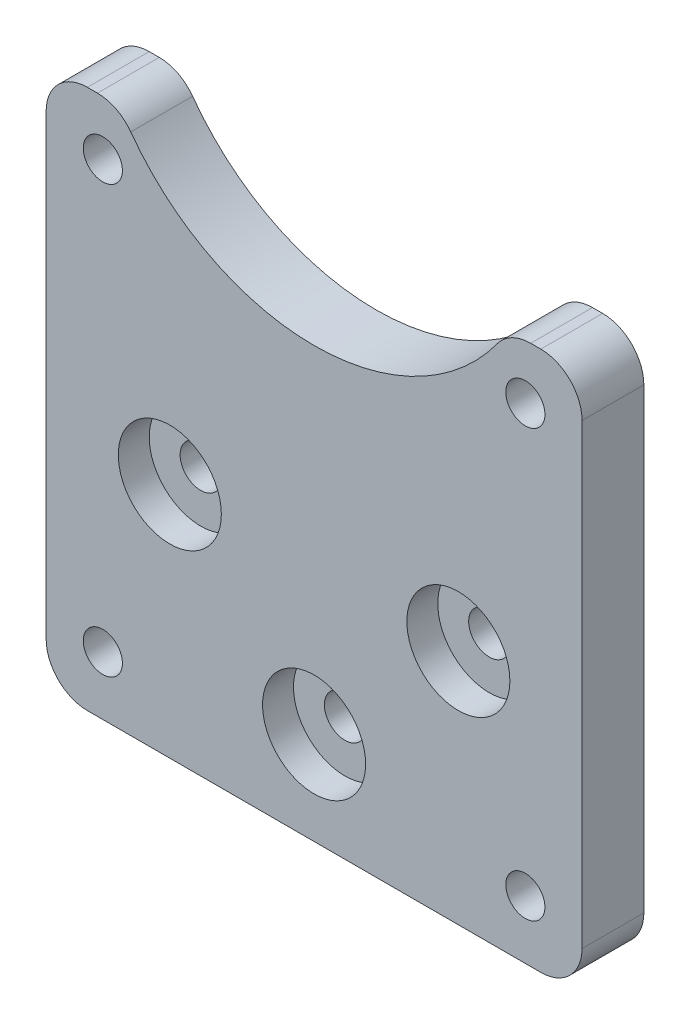
ISO-10303-21;
HEADER;
FILE_DESCRIPTION(('STEP AP214'),'2;1');
FILE_NAME('part.step','',(''),(''),'','','');
FILE_SCHEMA(('AUTOMOTIVE_DESIGN { 1 0 10303 214 1 1 1 1 }'));
ENDSEC;
DATA;
#1=APPLICATION_CONTEXT('core data for automotive mechanical design processes');
#2=APPLICATION_PROTOCOL_DEFINITION('international standard','automotive_design',2000,#1);
#3=PRODUCT_CONTEXT('',#1,'mechanical');
#4=PRODUCT('Part','Part','',(#3));
#5=PRODUCT_RELATED_PRODUCT_CATEGORY('part','',(#4));
#6=PRODUCT_DEFINITION_FORMATION('','',#4);
#7=PRODUCT_DEFINITION_CONTEXT('part definition',#1,'design');
#8=PRODUCT_DEFINITION('design','',#6,#7);
#9=PRODUCT_DEFINITION_SHAPE('','',#8);
#10=(LENGTH_UNIT() NAMED_UNIT(*) SI_UNIT(.MILLI.,.METRE.));
#11=(NAMED_UNIT(*) PLANE_ANGLE_UNIT() SI_UNIT($,.RADIAN.));
#12=(NAMED_UNIT(*) SI_UNIT($,.STERADIAN.) SOLID_ANGLE_UNIT());
#13=UNCERTAINTY_MEASURE_WITH_UNIT(LENGTH_MEASURE(1.E-05),#10,'distance_accuracy_value','');
#14=(GEOMETRIC_REPRESENTATION_CONTEXT(3) GLOBAL_UNCERTAINTY_ASSIGNED_CONTEXT((#13)) GLOBAL_UNIT_ASSIGNED_CONTEXT((#10,
#11,#12)) REPRESENTATION_CONTEXT('',''));
#15=CARTESIAN_POINT('',(0.,0.,0.));
#16=DIRECTION('',(0.,0.,1.));
#17=DIRECTION('',(1.,0.,0.));
#18=AXIS2_PLACEMENT_3D('',#15,#16,#17);
#19=CARTESIAN_POINT('',(7.00000000000001,3.5,3.));
#20=DIRECTION('',(0.,0.,-1.));
#21=DIRECTION('',(-1.,0.,0.));
#22=AXIS2_PLACEMENT_3D('',#19,#20,#21);
#23=CYLINDRICAL_SURFACE('',#22,1.);
#24=CARTESIAN_POINT('',(7.00000000000001,3.5,0.));
#25=DIRECTION('',(0.,0.,1.));
#26=DIRECTION('',(1.,0.,0.));
#27=AXIS2_PLACEMENT_3D('',#24,#25,#26);
#28=CIRCLE('',#27,1.);
#29=CARTESIAN_POINT('',(8.00000000000001,3.5,0.));
#30=VERTEX_POINT('',#29);
#31=EDGE_CURVE('E228',#30,#30,#28,.T.);
#32=ORIENTED_EDGE('',*,*,#31,.F.);
#33=EDGE_LOOP('',(#32));
#34=FACE_BOUND('',#33,.T.);
#35=CARTESIAN_POINT('',(7.00000000000001,3.5,1.5));
#36=DIRECTION('',(0.,0.,1.));
#37=DIRECTION('',(1.,0.,0.));
#38=AXIS2_PLACEMENT_3D('',#35,#36,#37);
#39=CIRCLE('',#38,1.);
#40=CARTESIAN_POINT('',(8.00000000000001,3.5,1.5));
#41=VERTEX_POINT('',#40);
#42=EDGE_CURVE('E169',#41,#41,#39,.T.);
#43=ORIENTED_EDGE('',*,*,#42,.T.);
#44=EDGE_LOOP('',(#43));
#45=FACE_BOUND('',#44,.T.);
#46=ADVANCED_FACE('F35',(#34,#45),#23,.F.);
#47=CARTESIAN_POINT('',(-6.99999999999999,3.5,3.));
#48=DIRECTION('',(0.,0.,-1.));
#49=DIRECTION('',(-1.,0.,0.));
#50=AXIS2_PLACEMENT_3D('',#47,#48,#49);
#51=CYLINDRICAL_SURFACE('',#50,1.);
#52=CARTESIAN_POINT('',(-6.99999999999999,3.5,0.));
#53=DIRECTION('',(0.,0.,1.));
#54=DIRECTION('',(-1.,0.,0.));
#55=AXIS2_PLACEMENT_3D('',#52,#53,#54);
#56=CIRCLE('',#55,1.);
#57=CARTESIAN_POINT('',(-8.,3.5,0.));
#58=VERTEX_POINT('',#57);
#59=EDGE_CURVE('E254',#58,#58,#56,.T.);
#60=ORIENTED_EDGE('',*,*,#59,.F.);
#61=EDGE_LOOP('',(#60));
#62=FACE_BOUND('',#61,.T.);
#63=CARTESIAN_POINT('',(-6.99999999999999,3.5,1.5));
#64=DIRECTION('',(0.,0.,1.));
#65=DIRECTION('',(1.,0.,0.));
#66=AXIS2_PLACEMENT_3D('',#63,#64,#65);
#67=CIRCLE('',#66,1.);
#68=CARTESIAN_POINT('',(-5.99999999999999,3.5,1.5));
#69=VERTEX_POINT('',#68);
#70=EDGE_CURVE('E165',#69,#69,#67,.T.);
#71=ORIENTED_EDGE('',*,*,#70,.T.);
#72=EDGE_LOOP('',(#71));
#73=FACE_BOUND('',#72,.T.);
#74=ADVANCED_FACE('F354',(#62,#73),#51,.F.);
#75=CARTESIAN_POINT('',(0.,-3.5,3.));
#76=DIRECTION('',(0.,0.,-1.));
#77=DIRECTION('',(-1.,0.,0.));
#78=AXIS2_PLACEMENT_3D('',#75,#76,#77);
#79=CYLINDRICAL_SURFACE('',#78,1.);
#80=CARTESIAN_POINT('',(0.,-3.5,0.));
#81=DIRECTION('',(0.,0.,1.));
#82=DIRECTION('',(1.,0.,0.));
#83=AXIS2_PLACEMENT_3D('',#80,#81,#82);
#84=CIRCLE('',#83,1.);
#85=CARTESIAN_POINT('',(1.00000000000001,-3.5,0.));
#86=VERTEX_POINT('',#85);
#87=EDGE_CURVE('E257',#86,#86,#84,.T.);
#88=ORIENTED_EDGE('',*,*,#87,.F.);
#89=EDGE_LOOP('',(#88));
#90=FACE_BOUND('',#89,.T.);
#91=CARTESIAN_POINT('',(0.,-3.5,1.5));
#92=DIRECTION('',(0.,0.,1.));
#93=DIRECTION('',(1.,0.,0.));
#94=AXIS2_PLACEMENT_3D('',#91,#92,#93);
#95=CIRCLE('',#94,1.);
#96=CARTESIAN_POINT('',(1.00000000000001,-3.5,1.5));
#97=VERTEX_POINT('',#96);
#98=EDGE_CURVE('E162',#97,#97,#95,.T.);
#99=ORIENTED_EDGE('',*,*,#98,.T.);
#100=EDGE_LOOP('',(#99));
#101=FACE_BOUND('',#100,.T.);
#102=ADVANCED_FACE('F312',(#90,#101),#79,.F.);
#103=CARTESIAN_POINT('',(0.,23.8400121122048,3.));
#104=DIRECTION('',(0.,0.,1.));
#105=DIRECTION('',(1.,0.,0.));
#106=AXIS2_PLACEMENT_3D('',#103,#104,#105);
#107=PLANE('',#106);
#108=CARTESIAN_POINT('',(-6.99999999999999,3.5,3.));
#109=DIRECTION('',(0.,0.,1.));
#110=DIRECTION('',(1.,0.,0.));
#111=AXIS2_PLACEMENT_3D('',#108,#109,#110);
#112=CIRCLE('',#111,2.5);
#113=CARTESIAN_POINT('',(-4.5,3.5,3.));
#114=VERTEX_POINT('',#113);
#115=EDGE_CURVE('E295',#114,#114,#112,.T.);
#116=ORIENTED_EDGE('',*,*,#115,.F.);
#117=EDGE_LOOP('',(#116));
#118=FACE_BOUND('',#117,.T.);
#119=CARTESIAN_POINT('',(7.00000000000001,3.5,3.));
#120=DIRECTION('',(0.,0.,1.));
#121=DIRECTION('',(1.,0.,0.));
#122=AXIS2_PLACEMENT_3D('',#119,#120,#121);
#123=CIRCLE('',#122,2.5);
#124=CARTESIAN_POINT('',(9.50000000000001,3.5,3.));
#125=VERTEX_POINT('',#124);
#126=EDGE_CURVE('E289',#125,#125,#123,.T.);
#127=ORIENTED_EDGE('',*,*,#126,.F.);
#128=EDGE_LOOP('',(#127));
#129=FACE_BOUND('',#128,.T.);
#130=CARTESIAN_POINT('',(0.,-3.5,3.));
#131=DIRECTION('',(0.,0.,1.));
#132=DIRECTION('',(1.,0.,0.));
#133=AXIS2_PLACEMENT_3D('',#130,#131,#132);
#134=CIRCLE('',#133,2.5);
#135=CARTESIAN_POINT('',(2.50000000000001,-3.5,3.));
#136=VERTEX_POINT('',#135);
#137=EDGE_CURVE('E283',#136,#136,#134,.T.);
#138=ORIENTED_EDGE('',*,*,#137,.F.);
#139=EDGE_LOOP('',(#138));
#140=FACE_BOUND('',#139,.T.);
#141=CARTESIAN_POINT('',(-10.2499999999998,-5.15998788779531,3.));
#142=DIRECTION('',(0.,0.,1.));
#143=DIRECTION('',(1.,0.,0.));
#144=AXIS2_PLACEMENT_3D('',#141,#142,#143);
#145=CIRCLE('',#144,0.949999999999999);
#146=CARTESIAN_POINT('',(-9.29999999999979,-5.15998788779531,3.));
#147=VERTEX_POINT('',#146);
#148=EDGE_CURVE('E270',#147,#147,#145,.T.);
#149=ORIENTED_EDGE('',*,*,#148,.F.);
#150=EDGE_LOOP('',(#149));
#151=FACE_BOUND('',#150,.T.);
#152=CARTESIAN_POINT('',(10.2500000000001,15.5400121122048,3.));
#153=DIRECTION('',(0.,0.,1.));
#154=DIRECTION('',(1.,0.,0.));
#155=AXIS2_PLACEMENT_3D('',#152,#153,#154);
#156=CIRCLE('',#155,0.949999999999999);
#157=CARTESIAN_POINT('',(11.2000000000001,15.5400121122048,3.));
#158=VERTEX_POINT('',#157);
#159=EDGE_CURVE('E260',#158,#158,#156,.T.);
#160=ORIENTED_EDGE('',*,*,#159,.F.);
#161=EDGE_LOOP('',(#160));
#162=FACE_BOUND('',#161,.T.);
#163=DIRECTION('',(0.,-1.,0.));
#164=VECTOR('',#163,1.);
#165=CARTESIAN_POINT('',(-13.,18.1900121122046,3.));
#166=LINE('',#165,#164);
#167=CARTESIAN_POINT('',(-13.,16.1900121122046,3.));
#168=VERTEX_POINT('',#167);
#169=CARTESIAN_POINT('',(-13.,-5.99999999999999,3.));
#170=VERTEX_POINT('',#169);
#171=EDGE_CURVE('E242',#168,#170,#166,.T.);
#172=ORIENTED_EDGE('',*,*,#171,.T.);
#173=CARTESIAN_POINT('',(-11.,-6.,3.));
#174=DIRECTION('',(0.,0.,1.));
#175=DIRECTION('',(1.,0.,0.));
#176=AXIS2_PLACEMENT_3D('',#173,#174,#175);
#177=CIRCLE('',#176,2.);
#178=CARTESIAN_POINT('',(-11.,-8.,3.));
#179=VERTEX_POINT('',#178);
#180=EDGE_CURVE('E194',#170,#179,#177,.T.);
#181=ORIENTED_EDGE('',*,*,#180,.T.);
#182=DIRECTION('',(1.,0.,0.));
#183=VECTOR('',#182,1.);
#184=CARTESIAN_POINT('',(-13.,-8.,3.));
#185=LINE('',#184,#183);
#186=CARTESIAN_POINT('',(11.,-8.,3.));
#187=VERTEX_POINT('',#186);
#188=EDGE_CURVE('E145',#179,#187,#185,.T.);
#189=ORIENTED_EDGE('',*,*,#188,.T.);
#190=CARTESIAN_POINT('',(11.,-5.99999999999999,3.));
#191=DIRECTION('',(0.,0.,1.));
#192=DIRECTION('',(1.,0.,0.));
#193=AXIS2_PLACEMENT_3D('',#190,#191,#192);
#194=CIRCLE('',#193,2.);
#195=CARTESIAN_POINT('',(13.,-5.99999999999999,3.));
#196=VERTEX_POINT('',#195);
#197=EDGE_CURVE('E192',#187,#196,#194,.T.);
#198=ORIENTED_EDGE('',*,*,#197,.T.);
#199=DIRECTION('',(0.,1.,0.));
#200=VECTOR('',#199,1.);
#201=CARTESIAN_POINT('',(13.,18.1900121122048,3.));
#202=LINE('',#201,#200);
#203=CARTESIAN_POINT('',(13.,16.1900121122048,3.));
#204=VERTEX_POINT('',#203);
#205=EDGE_CURVE('E152',#196,#204,#202,.T.);
#206=ORIENTED_EDGE('',*,*,#205,.T.);
#207=CARTESIAN_POINT('',(11.,16.1900121122048,3.));
#208=DIRECTION('',(0.,0.,1.));
#209=DIRECTION('',(1.,0.,0.));
#210=AXIS2_PLACEMENT_3D('',#207,#208,#209);
#211=CIRCLE('',#210,2.);
#212=CARTESIAN_POINT('',(11.,18.1900121122048,3.));
#213=VERTEX_POINT('',#212);
#214=EDGE_CURVE('E185',#204,#213,#211,.T.);
#215=ORIENTED_EDGE('',*,*,#214,.T.);
#216=DIRECTION('',(-1.,0.,0.));
#217=VECTOR('',#216,1.);
#218=CARTESIAN_POINT('',(9.43808773004362,18.1900121122048,3.));
#219=LINE('',#218,#217);
#220=CARTESIAN_POINT('',(10.5108277504676,18.1900121122048,3.));
#221=VERTEX_POINT('',#220);
#222=EDGE_CURVE('E156',#213,#221,#219,.T.);
#223=ORIENTED_EDGE('',*,*,#222,.T.);
#224=CARTESIAN_POINT('',(10.5108277504676,16.1900121122048,3.));
#225=DIRECTION('',(0.,0.,1.));
#226=DIRECTION('',(1.,0.,0.));
#227=AXIS2_PLACEMENT_3D('',#224,#225,#226);
#228=CIRCLE('',#227,2.);
#229=CARTESIAN_POINT('',(8.89377732731875,17.3669351891278,3.));
#230=VERTEX_POINT('',#229);
#231=EDGE_CURVE('E188',#221,#230,#228,.T.);
#232=ORIENTED_EDGE('',*,*,#231,.T.);
#233=CARTESIAN_POINT('',(0.,23.8400121122048,3.));
#234=DIRECTION('',(0.,0.,-1.));
#235=DIRECTION('',(1.,0.,0.));
#236=AXIS2_PLACEMENT_3D('',#233,#234,#235);
#237=CIRCLE('',#236,11.);
#238=CARTESIAN_POINT('',(-8.89377732731866,17.3669351891277,3.));
#239=VERTEX_POINT('',#238);
#240=EDGE_CURVE('E247',#230,#239,#237,.T.);
#241=ORIENTED_EDGE('',*,*,#240,.T.);
#242=CARTESIAN_POINT('',(-10.5108277504675,16.1900121122046,3.));
#243=DIRECTION('',(0.,0.,1.));
#244=DIRECTION('',(1.,0.,0.));
#245=AXIS2_PLACEMENT_3D('',#242,#243,#244);
#246=CIRCLE('',#245,2.);
#247=CARTESIAN_POINT('',(-10.5108277504675,18.1900121122046,3.));
#248=VERTEX_POINT('',#247);
#249=EDGE_CURVE('E57',#239,#248,#246,.T.);
#250=ORIENTED_EDGE('',*,*,#249,.T.);
#251=DIRECTION('',(-1.,0.,0.));
#252=VECTOR('',#251,1.);
#253=CARTESIAN_POINT('',(-13.,18.1900121122046,3.));
#254=LINE('',#253,#252);
#255=CARTESIAN_POINT('',(-11.,18.1900121122046,3.));
#256=VERTEX_POINT('',#255);
#257=EDGE_CURVE('E243',#248,#256,#254,.T.);
#258=ORIENTED_EDGE('',*,*,#257,.T.);
#259=CARTESIAN_POINT('',(-11.,16.1900121122046,3.));
#260=DIRECTION('',(0.,0.,1.));
#261=DIRECTION('',(1.,0.,0.));
#262=AXIS2_PLACEMENT_3D('',#259,#260,#261);
#263=CIRCLE('',#262,2.);
#264=EDGE_CURVE('E190',#256,#168,#263,.T.);
#265=ORIENTED_EDGE('',*,*,#264,.T.);
#266=EDGE_LOOP('',(#172,#181,#189,#198,#206,#215,#223,#232,#241,#250,#258,#265));
#267=FACE_BOUND('',#266,.T.);
#268=CARTESIAN_POINT('',(-10.2499999999999,15.5400121122042,3.));
#269=DIRECTION('',(0.,0.,1.));
#270=DIRECTION('',(-1.,0.,0.));
#271=AXIS2_PLACEMENT_3D('',#268,#269,#270);
#272=CIRCLE('',#271,0.95);
#273=CARTESIAN_POINT('',(-11.1999999999999,15.5400121122042,3.));
#274=VERTEX_POINT('',#273);
#275=EDGE_CURVE('E264',#274,#274,#272,.T.);
#276=ORIENTED_EDGE('',*,*,#275,.F.);
#277=EDGE_LOOP('',(#276));
#278=FACE_BOUND('',#277,.T.);
#279=CARTESIAN_POINT('',(10.2500000000003,-5.15998788779515,3.));
#280=DIRECTION('',(0.,0.,1.));
#281=DIRECTION('',(-1.,0.,0.));
#282=AXIS2_PLACEMENT_3D('',#279,#280,#281);
#283=CIRCLE('',#282,0.949999999999999);
#284=CARTESIAN_POINT('',(9.30000000000027,-5.15998788779515,3.));
#285=VERTEX_POINT('',#284);
#286=EDGE_CURVE('E276',#285,#285,#283,.T.);
#287=ORIENTED_EDGE('',*,*,#286,.F.);
#288=EDGE_LOOP('',(#287));
#289=FACE_BOUND('',#288,.T.);
#290=ADVANCED_FACE('F240',(#118,#129,#140,#151,#162,#267,#278,#289),#107,.T.);
#291=CARTESIAN_POINT('',(0.,23.8400121122048,0.));
#292=DIRECTION('',(0.,0.,1.));
#293=DIRECTION('',(1.,0.,0.));
#294=AXIS2_PLACEMENT_3D('',#291,#292,#293);
#295=PLANE('',#294);
#296=DIRECTION('',(1.,0.,0.));
#297=VECTOR('',#296,1.);
#298=CARTESIAN_POINT('',(-13.,-8.,0.));
#299=LINE('',#298,#297);
#300=CARTESIAN_POINT('',(-11.,-8.,0.));
#301=VERTEX_POINT('',#300);
#302=CARTESIAN_POINT('',(11.,-8.,0.));
#303=VERTEX_POINT('',#302);
#304=EDGE_CURVE('E142',#301,#303,#299,.T.);
#305=ORIENTED_EDGE('',*,*,#304,.F.);
#306=CARTESIAN_POINT('',(-11.,-6.,0.));
#307=DIRECTION('',(0.,0.,1.));
#308=DIRECTION('',(1.,0.,0.));
#309=AXIS2_PLACEMENT_3D('',#306,#307,#308);
#310=CIRCLE('',#309,2.);
#311=CARTESIAN_POINT('',(-13.,-5.99999999999999,0.));
#312=VERTEX_POINT('',#311);
#313=EDGE_CURVE('E125',#301,#312,#310,.F.);
#314=ORIENTED_EDGE('',*,*,#313,.T.);
#315=DIRECTION('',(0.,-1.,0.));
#316=VECTOR('',#315,1.);
#317=CARTESIAN_POINT('',(-13.,18.1900121122046,0.));
#318=LINE('',#317,#316);
#319=CARTESIAN_POINT('',(-13.,16.1900121122046,0.));
#320=VERTEX_POINT('',#319);
#321=EDGE_CURVE('E153',#320,#312,#318,.T.);
#322=ORIENTED_EDGE('',*,*,#321,.F.);
#323=CARTESIAN_POINT('',(-11.,16.1900121122046,0.));
#324=DIRECTION('',(0.,0.,1.));
#325=DIRECTION('',(1.,0.,0.));
#326=AXIS2_PLACEMENT_3D('',#323,#324,#325);
#327=CIRCLE('',#326,2.);
#328=CARTESIAN_POINT('',(-11.,18.1900121122046,0.));
#329=VERTEX_POINT('',#328);
#330=EDGE_CURVE('E179',#320,#329,#327,.F.);
#331=ORIENTED_EDGE('',*,*,#330,.T.);
#332=DIRECTION('',(-1.,0.,0.));
#333=VECTOR('',#332,1.);
#334=CARTESIAN_POINT('',(-13.,18.1900121122046,0.));
#335=LINE('',#334,#333);
#336=CARTESIAN_POINT('',(-10.5108277504675,18.1900121122046,0.));
#337=VERTEX_POINT('',#336);
#338=EDGE_CURVE('E158',#337,#329,#335,.T.);
#339=ORIENTED_EDGE('',*,*,#338,.F.);
#340=CARTESIAN_POINT('',(-10.5108277504675,16.1900121122046,0.));
#341=DIRECTION('',(0.,0.,1.));
#342=DIRECTION('',(1.,0.,0.));
#343=AXIS2_PLACEMENT_3D('',#340,#341,#342);
#344=CIRCLE('',#343,2.);
#345=CARTESIAN_POINT('',(-8.89377732731866,17.3669351891277,0.));
#346=VERTEX_POINT('',#345);
#347=EDGE_CURVE('E175',#337,#346,#344,.F.);
#348=ORIENTED_EDGE('',*,*,#347,.T.);
#349=CARTESIAN_POINT('',(0.,23.8400121122048,0.));
#350=DIRECTION('',(0.,0.,-1.));
#351=DIRECTION('',(1.,0.,0.));
#352=AXIS2_PLACEMENT_3D('',#349,#350,#351);
#353=CIRCLE('',#352,11.);
#354=CARTESIAN_POINT('',(8.89377732731875,17.3669351891278,0.));
#355=VERTEX_POINT('',#354);
#356=EDGE_CURVE('E223',#355,#346,#353,.T.);
#357=ORIENTED_EDGE('',*,*,#356,.F.);
#358=CARTESIAN_POINT('',(10.5108277504676,16.1900121122048,0.));
#359=DIRECTION('',(0.,0.,1.));
#360=DIRECTION('',(1.,0.,0.));
#361=AXIS2_PLACEMENT_3D('',#358,#359,#360);
#362=CIRCLE('',#361,2.);
#363=CARTESIAN_POINT('',(10.5108277504676,18.1900121122048,0.));
#364=VERTEX_POINT('',#363);
#365=EDGE_CURVE('E177',#355,#364,#362,.F.);
#366=ORIENTED_EDGE('',*,*,#365,.T.);
#367=DIRECTION('',(-1.,0.,0.));
#368=VECTOR('',#367,1.);
#369=CARTESIAN_POINT('',(9.43808773004362,18.1900121122048,0.));
#370=LINE('',#369,#368);
#371=CARTESIAN_POINT('',(11.,18.1900121122048,0.));
#372=VERTEX_POINT('',#371);
#373=EDGE_CURVE('E216',#372,#364,#370,.T.);
#374=ORIENTED_EDGE('',*,*,#373,.F.);
#375=CARTESIAN_POINT('',(11.,16.1900121122048,0.));
#376=DIRECTION('',(0.,0.,1.));
#377=DIRECTION('',(1.,0.,0.));
#378=AXIS2_PLACEMENT_3D('',#375,#376,#377);
#379=CIRCLE('',#378,2.);
#380=CARTESIAN_POINT('',(13.,16.1900121122048,0.));
#381=VERTEX_POINT('',#380);
#382=EDGE_CURVE('E146',#372,#381,#379,.F.);
#383=ORIENTED_EDGE('',*,*,#382,.T.);
#384=DIRECTION('',(0.,1.,0.));
#385=VECTOR('',#384,1.);
#386=CARTESIAN_POINT('',(13.,18.1900121122048,0.));
#387=LINE('',#386,#385);
#388=CARTESIAN_POINT('',(13.,-5.99999999999999,0.));
#389=VERTEX_POINT('',#388);
#390=EDGE_CURVE('E224',#389,#381,#387,.T.);
#391=ORIENTED_EDGE('',*,*,#390,.F.);
#392=CARTESIAN_POINT('',(11.,-5.99999999999999,0.));
#393=DIRECTION('',(0.,0.,1.));
#394=DIRECTION('',(1.,0.,0.));
#395=AXIS2_PLACEMENT_3D('',#392,#393,#394);
#396=CIRCLE('',#395,2.);
#397=EDGE_CURVE('E136',#389,#303,#396,.F.);
#398=ORIENTED_EDGE('',*,*,#397,.T.);
#399=EDGE_LOOP('',(#305,#314,#322,#331,#339,#348,#357,#366,#374,#383,#391,#398));
#400=FACE_BOUND('',#399,.T.);
#401=ORIENTED_EDGE('',*,*,#31,.T.);
#402=EDGE_LOOP('',(#401));
#403=FACE_BOUND('',#402,.T.);
#404=ORIENTED_EDGE('',*,*,#59,.T.);
#405=EDGE_LOOP('',(#404));
#406=FACE_BOUND('',#405,.T.);
#407=ORIENTED_EDGE('',*,*,#87,.T.);
#408=EDGE_LOOP('',(#407));
#409=FACE_BOUND('',#408,.T.);
#410=CARTESIAN_POINT('',(10.2500000000001,15.5400121122048,0.));
#411=DIRECTION('',(0.,0.,1.));
#412=DIRECTION('',(1.,0.,0.));
#413=AXIS2_PLACEMENT_3D('',#410,#411,#412);
#414=CIRCLE('',#413,0.949999999999999);
#415=CARTESIAN_POINT('',(11.2000000000001,15.5400121122048,0.));
#416=VERTEX_POINT('',#415);
#417=EDGE_CURVE('E261',#416,#416,#414,.T.);
#418=ORIENTED_EDGE('',*,*,#417,.T.);
#419=EDGE_LOOP('',(#418));
#420=FACE_BOUND('',#419,.T.);
#421=CARTESIAN_POINT('',(-10.2499999999999,15.5400121122042,0.));
#422=DIRECTION('',(0.,0.,1.));
#423=DIRECTION('',(-1.,0.,0.));
#424=AXIS2_PLACEMENT_3D('',#421,#422,#423);
#425=CIRCLE('',#424,0.95);
#426=CARTESIAN_POINT('',(-11.1999999999999,15.5400121122042,0.));
#427=VERTEX_POINT('',#426);
#428=EDGE_CURVE('E267',#427,#427,#425,.T.);
#429=ORIENTED_EDGE('',*,*,#428,.T.);
#430=EDGE_LOOP('',(#429));
#431=FACE_BOUND('',#430,.T.);
#432=CARTESIAN_POINT('',(-10.2499999999998,-5.15998788779531,0.));
#433=DIRECTION('',(0.,0.,1.));
#434=DIRECTION('',(1.,0.,0.));
#435=AXIS2_PLACEMENT_3D('',#432,#433,#434);
#436=CIRCLE('',#435,0.949999999999999);
#437=CARTESIAN_POINT('',(-9.29999999999979,-5.15998788779531,0.));
#438=VERTEX_POINT('',#437);
#439=EDGE_CURVE('E273',#438,#438,#436,.T.);
#440=ORIENTED_EDGE('',*,*,#439,.T.);
#441=EDGE_LOOP('',(#440));
#442=FACE_BOUND('',#441,.T.);
#443=CARTESIAN_POINT('',(10.2500000000003,-5.15998788779515,0.));
#444=DIRECTION('',(0.,0.,1.));
#445=DIRECTION('',(-1.,0.,0.));
#446=AXIS2_PLACEMENT_3D('',#443,#444,#445);
#447=CIRCLE('',#446,0.949999999999999);
#448=CARTESIAN_POINT('',(9.30000000000027,-5.15998788779515,0.));
#449=VERTEX_POINT('',#448);
#450=EDGE_CURVE('E172',#449,#449,#447,.T.);
#451=ORIENTED_EDGE('',*,*,#450,.T.);
#452=EDGE_LOOP('',(#451));
#453=FACE_BOUND('',#452,.T.);
#454=ADVANCED_FACE('F149',(#400,#403,#406,#409,#420,#431,#442,#453),#295,.F.);
#455=CARTESIAN_POINT('',(13.,18.1900121122048,3.));
#456=DIRECTION('',(-1.,0.,0.));
#457=DIRECTION('',(0.,-1.,0.));
#458=AXIS2_PLACEMENT_3D('',#455,#456,#457);
#459=PLANE('',#458);
#460=ORIENTED_EDGE('',*,*,#205,.F.);
#461=DIRECTION('',(0.,0.,-1.));
#462=VECTOR('',#461,1.);
#463=CARTESIAN_POINT('',(13.,-5.99999999999999,3.));
#464=LINE('',#463,#462);
#465=EDGE_CURVE('E198',#196,#389,#464,.T.);
#466=ORIENTED_EDGE('',*,*,#465,.T.);
#467=ORIENTED_EDGE('',*,*,#390,.T.);
#468=DIRECTION('',(0.,0.,-1.));
#469=VECTOR('',#468,1.);
#470=CARTESIAN_POINT('',(13.,16.1900121122048,3.));
#471=LINE('',#470,#469);
#472=EDGE_CURVE('E196',#381,#204,#471,.F.);
#473=ORIENTED_EDGE('',*,*,#472,.T.);
#474=EDGE_LOOP('',(#460,#466,#467,#473));
#475=FACE_BOUND('',#474,.T.);
#476=ADVANCED_FACE('F331',(#475),#459,.F.);
#477=CARTESIAN_POINT('',(9.43808773004362,18.1900121122048,3.));
#478=DIRECTION('',(0.,-1.,0.));
#479=DIRECTION('',(1.,0.,0.));
#480=AXIS2_PLACEMENT_3D('',#477,#478,#479);
#481=PLANE('',#480);
#482=ORIENTED_EDGE('',*,*,#373,.T.);
#483=DIRECTION('',(0.,0.,-1.));
#484=VECTOR('',#483,1.);
#485=CARTESIAN_POINT('',(10.5108277504676,18.1900121122048,3.));
#486=LINE('',#485,#484);
#487=EDGE_CURVE('E11',#364,#221,#486,.F.);
#488=ORIENTED_EDGE('',*,*,#487,.T.);
#489=ORIENTED_EDGE('',*,*,#222,.F.);
#490=DIRECTION('',(0.,0.,-1.));
#491=VECTOR('',#490,1.);
#492=CARTESIAN_POINT('',(11.,18.1900121122048,3.));
#493=LINE('',#492,#491);
#494=EDGE_CURVE('E43',#213,#372,#493,.T.);
#495=ORIENTED_EDGE('',*,*,#494,.T.);
#496=EDGE_LOOP('',(#482,#488,#489,#495));
#497=FACE_BOUND('',#496,.T.);
#498=ADVANCED_FACE('F215',(#497),#481,.F.);
#499=CARTESIAN_POINT('',(0.,23.8400121122048,3.));
#500=DIRECTION('',(0.,0.,-1.));
#501=DIRECTION('',(-1.,0.,0.));
#502=AXIS2_PLACEMENT_3D('',#499,#500,#501);
#503=CYLINDRICAL_SURFACE('',#502,11.);
#504=ORIENTED_EDGE('',*,*,#240,.F.);
#505=DIRECTION('',(0.,0.,-1.));
#506=VECTOR('',#505,1.);
#507=CARTESIAN_POINT('',(8.89377732731875,17.3669351891278,3.));
#508=LINE('',#507,#506);
#509=EDGE_CURVE('E207',#230,#355,#508,.T.);
#510=ORIENTED_EDGE('',*,*,#509,.T.);
#511=ORIENTED_EDGE('',*,*,#356,.T.);
#512=DIRECTION('',(0.,0.,-1.));
#513=VECTOR('',#512,1.);
#514=CARTESIAN_POINT('',(-8.89377732731866,17.3669351891277,3.));
#515=LINE('',#514,#513);
#516=EDGE_CURVE('E205',#346,#239,#515,.F.);
#517=ORIENTED_EDGE('',*,*,#516,.T.);
#518=EDGE_LOOP('',(#504,#510,#511,#517));
#519=FACE_BOUND('',#518,.T.);
#520=ADVANCED_FACE('F372',(#519),#503,.F.);
#521=CARTESIAN_POINT('',(-13.,18.1900121122046,3.));
#522=DIRECTION('',(0.,-1.,0.));
#523=DIRECTION('',(1.,0.,0.));
#524=AXIS2_PLACEMENT_3D('',#521,#522,#523);
#525=PLANE('',#524);
#526=ORIENTED_EDGE('',*,*,#338,.T.);
#527=DIRECTION('',(0.,0.,-1.));
#528=VECTOR('',#527,1.);
#529=CARTESIAN_POINT('',(-11.,18.1900121122046,3.));
#530=LINE('',#529,#528);
#531=EDGE_CURVE('E50',#329,#256,#530,.F.);
#532=ORIENTED_EDGE('',*,*,#531,.T.);
#533=ORIENTED_EDGE('',*,*,#257,.F.);
#534=DIRECTION('',(0.,0.,-1.));
#535=VECTOR('',#534,1.);
#536=CARTESIAN_POINT('',(-10.5108277504675,18.1900121122046,3.));
#537=LINE('',#536,#535);
#538=EDGE_CURVE('E201',#248,#337,#537,.T.);
#539=ORIENTED_EDGE('',*,*,#538,.T.);
#540=EDGE_LOOP('',(#526,#532,#533,#539));
#541=FACE_BOUND('',#540,.T.);
#542=ADVANCED_FACE('F232',(#541),#525,.F.);
#543=CARTESIAN_POINT('',(-13.,18.1900121122046,3.));
#544=DIRECTION('',(1.,0.,0.));
#545=DIRECTION('',(0.,1.,0.));
#546=AXIS2_PLACEMENT_3D('',#543,#544,#545);
#547=PLANE('',#546);
#548=ORIENTED_EDGE('',*,*,#321,.T.);
#549=DIRECTION('',(0.,0.,-1.));
#550=VECTOR('',#549,1.);
#551=CARTESIAN_POINT('',(-13.,-6.,3.));
#552=LINE('',#551,#550);
#553=EDGE_CURVE('E130',#312,#170,#552,.F.);
#554=ORIENTED_EDGE('',*,*,#553,.T.);
#555=ORIENTED_EDGE('',*,*,#171,.F.);
#556=DIRECTION('',(0.,0.,-1.));
#557=VECTOR('',#556,1.);
#558=CARTESIAN_POINT('',(-13.,16.1900121122046,3.));
#559=LINE('',#558,#557);
#560=EDGE_CURVE('E135',#168,#320,#559,.T.);
#561=ORIENTED_EDGE('',*,*,#560,.T.);
#562=EDGE_LOOP('',(#548,#554,#555,#561));
#563=FACE_BOUND('',#562,.T.);
#564=ADVANCED_FACE('F245',(#563),#547,.F.);
#565=CARTESIAN_POINT('',(-13.,-8.,3.));
#566=DIRECTION('',(0.,1.,0.));
#567=DIRECTION('',(-1.,0.,0.));
#568=AXIS2_PLACEMENT_3D('',#565,#566,#567);
#569=PLANE('',#568);
#570=ORIENTED_EDGE('',*,*,#188,.F.);
#571=DIRECTION('',(0.,0.,-1.));
#572=VECTOR('',#571,1.);
#573=CARTESIAN_POINT('',(-11.,-8.,3.));
#574=LINE('',#573,#572);
#575=EDGE_CURVE('E129',#179,#301,#574,.T.);
#576=ORIENTED_EDGE('',*,*,#575,.T.);
#577=ORIENTED_EDGE('',*,*,#304,.T.);
#578=DIRECTION('',(0.,0.,-1.));
#579=VECTOR('',#578,1.);
#580=CARTESIAN_POINT('',(11.,-8.,3.));
#581=LINE('',#580,#579);
#582=EDGE_CURVE('E147',#303,#187,#581,.F.);
#583=ORIENTED_EDGE('',*,*,#582,.T.);
#584=EDGE_LOOP('',(#570,#576,#577,#583));
#585=FACE_BOUND('',#584,.T.);
#586=ADVANCED_FACE('F141',(#585),#569,.F.);
#587=CARTESIAN_POINT('',(10.2500000000001,15.5400121122048,3.));
#588=DIRECTION('',(0.,0.,-1.));
#589=DIRECTION('',(-1.,0.,0.));
#590=AXIS2_PLACEMENT_3D('',#587,#588,#589);
#591=CYLINDRICAL_SURFACE('',#590,0.949999999999999);
#592=ORIENTED_EDGE('',*,*,#159,.T.);
#593=EDGE_LOOP('',(#592));
#594=FACE_BOUND('',#593,.T.);
#595=ORIENTED_EDGE('',*,*,#417,.F.);
#596=EDGE_LOOP('',(#595));
#597=FACE_BOUND('',#596,.T.);
#598=ADVANCED_FACE('F322',(#594,#597),#591,.F.);
#599=CARTESIAN_POINT('',(-10.2499999999999,15.5400121122042,3.));
#600=DIRECTION('',(0.,0.,-1.));
#601=DIRECTION('',(-1.,0.,0.));
#602=AXIS2_PLACEMENT_3D('',#599,#600,#601);
#603=CYLINDRICAL_SURFACE('',#602,0.95);
#604=ORIENTED_EDGE('',*,*,#275,.T.);
#605=EDGE_LOOP('',(#604));
#606=FACE_BOUND('',#605,.T.);
#607=ORIENTED_EDGE('',*,*,#428,.F.);
#608=EDGE_LOOP('',(#607));
#609=FACE_BOUND('',#608,.T.);
#610=ADVANCED_FACE('F325',(#606,#609),#603,.F.);
#611=CARTESIAN_POINT('',(-10.2499999999998,-5.15998788779531,3.));
#612=DIRECTION('',(0.,0.,-1.));
#613=DIRECTION('',(-1.,0.,0.));
#614=AXIS2_PLACEMENT_3D('',#611,#612,#613);
#615=CYLINDRICAL_SURFACE('',#614,0.949999999999999);
#616=ORIENTED_EDGE('',*,*,#148,.T.);
#617=EDGE_LOOP('',(#616));
#618=FACE_BOUND('',#617,.T.);
#619=ORIENTED_EDGE('',*,*,#439,.F.);
#620=EDGE_LOOP('',(#619));
#621=FACE_BOUND('',#620,.T.);
#622=ADVANCED_FACE('F342',(#618,#621),#615,.F.);
#623=CARTESIAN_POINT('',(10.2500000000003,-5.15998788779515,3.));
#624=DIRECTION('',(0.,0.,-1.));
#625=DIRECTION('',(-1.,0.,0.));
#626=AXIS2_PLACEMENT_3D('',#623,#624,#625);
#627=CYLINDRICAL_SURFACE('',#626,0.949999999999999);
#628=ORIENTED_EDGE('',*,*,#286,.T.);
#629=EDGE_LOOP('',(#628));
#630=FACE_BOUND('',#629,.T.);
#631=ORIENTED_EDGE('',*,*,#450,.F.);
#632=EDGE_LOOP('',(#631));
#633=FACE_BOUND('',#632,.T.);
#634=ADVANCED_FACE('F339',(#630,#633),#627,.F.);
#635=CARTESIAN_POINT('',(0.,-3.5,1.5));
#636=DIRECTION('',(0.,0.,1.));
#637=DIRECTION('',(1.,0.,0.));
#638=AXIS2_PLACEMENT_3D('',#635,#636,#637);
#639=CYLINDRICAL_SURFACE('',#638,2.5);
#640=CARTESIAN_POINT('',(0.,-3.5,1.5));
#641=DIRECTION('',(0.,0.,1.));
#642=DIRECTION('',(1.,0.,0.));
#643=AXIS2_PLACEMENT_3D('',#640,#641,#642);
#644=CIRCLE('',#643,2.5);
#645=CARTESIAN_POINT('',(2.50000000000001,-3.5,1.5));
#646=VERTEX_POINT('',#645);
#647=EDGE_CURVE('E286',#646,#646,#644,.T.);
#648=ORIENTED_EDGE('',*,*,#647,.F.);
#649=EDGE_LOOP('',(#648));
#650=FACE_BOUND('',#649,.T.);
#651=ORIENTED_EDGE('',*,*,#137,.T.);
#652=EDGE_LOOP('',(#651));
#653=FACE_BOUND('',#652,.T.);
#654=ADVANCED_FACE('F341',(#650,#653),#639,.F.);
#655=CARTESIAN_POINT('',(0.,-3.5,1.5));
#656=DIRECTION('',(0.,0.,1.));
#657=DIRECTION('',(1.,0.,0.));
#658=AXIS2_PLACEMENT_3D('',#655,#656,#657);
#659=PLANE('',#658);
#660=ORIENTED_EDGE('',*,*,#98,.F.);
#661=EDGE_LOOP('',(#660));
#662=FACE_BOUND('',#661,.T.);
#663=ORIENTED_EDGE('',*,*,#647,.T.);
#664=EDGE_LOOP('',(#663));
#665=FACE_BOUND('',#664,.T.);
#666=ADVANCED_FACE('F306',(#662,#665),#659,.T.);
#667=CARTESIAN_POINT('',(-6.99999999999999,3.5,1.5));
#668=DIRECTION('',(0.,0.,1.));
#669=DIRECTION('',(1.,0.,0.));
#670=AXIS2_PLACEMENT_3D('',#667,#668,#669);
#671=CYLINDRICAL_SURFACE('',#670,2.5);
#672=CARTESIAN_POINT('',(-6.99999999999999,3.5,1.5));
#673=DIRECTION('',(0.,0.,1.));
#674=DIRECTION('',(1.,0.,0.));
#675=AXIS2_PLACEMENT_3D('',#672,#673,#674);
#676=CIRCLE('',#675,2.5);
#677=CARTESIAN_POINT('',(-4.5,3.5,1.5));
#678=VERTEX_POINT('',#677);
#679=EDGE_CURVE('E166',#678,#678,#676,.T.);
#680=ORIENTED_EDGE('',*,*,#679,.F.);
#681=EDGE_LOOP('',(#680));
#682=FACE_BOUND('',#681,.T.);
#683=ORIENTED_EDGE('',*,*,#115,.T.);
#684=EDGE_LOOP('',(#683));
#685=FACE_BOUND('',#684,.T.);
#686=ADVANCED_FACE('F303',(#682,#685),#671,.F.);
#687=CARTESIAN_POINT('',(-6.99999999999999,3.5,1.5));
#688=DIRECTION('',(0.,0.,1.));
#689=DIRECTION('',(1.,0.,0.));
#690=AXIS2_PLACEMENT_3D('',#687,#688,#689);
#691=PLANE('',#690);
#692=ORIENTED_EDGE('',*,*,#70,.F.);
#693=EDGE_LOOP('',(#692));
#694=FACE_BOUND('',#693,.T.);
#695=ORIENTED_EDGE('',*,*,#679,.T.);
#696=EDGE_LOOP('',(#695));
#697=FACE_BOUND('',#696,.T.);
#698=ADVANCED_FACE('F301',(#694,#697),#691,.T.);
#699=CARTESIAN_POINT('',(7.00000000000001,3.5,1.5));
#700=DIRECTION('',(0.,0.,1.));
#701=DIRECTION('',(1.,0.,0.));
#702=AXIS2_PLACEMENT_3D('',#699,#700,#701);
#703=CYLINDRICAL_SURFACE('',#702,2.5);
#704=CARTESIAN_POINT('',(7.00000000000001,3.5,1.5));
#705=DIRECTION('',(0.,0.,1.));
#706=DIRECTION('',(1.,0.,0.));
#707=AXIS2_PLACEMENT_3D('',#704,#705,#706);
#708=CIRCLE('',#707,2.5);
#709=CARTESIAN_POINT('',(9.50000000000001,3.5,1.5));
#710=VERTEX_POINT('',#709);
#711=EDGE_CURVE('E292',#710,#710,#708,.T.);
#712=ORIENTED_EDGE('',*,*,#711,.F.);
#713=EDGE_LOOP('',(#712));
#714=FACE_BOUND('',#713,.T.);
#715=ORIENTED_EDGE('',*,*,#126,.T.);
#716=EDGE_LOOP('',(#715));
#717=FACE_BOUND('',#716,.T.);
#718=ADVANCED_FACE('F479',(#714,#717),#703,.F.);
#719=CARTESIAN_POINT('',(7.00000000000001,3.5,1.5));
#720=DIRECTION('',(0.,0.,1.));
#721=DIRECTION('',(1.,0.,0.));
#722=AXIS2_PLACEMENT_3D('',#719,#720,#721);
#723=PLANE('',#722);
#724=ORIENTED_EDGE('',*,*,#42,.F.);
#725=EDGE_LOOP('',(#724));
#726=FACE_BOUND('',#725,.T.);
#727=ORIENTED_EDGE('',*,*,#711,.T.);
#728=EDGE_LOOP('',(#727));
#729=FACE_BOUND('',#728,.T.);
#730=ADVANCED_FACE('F384',(#726,#729),#723,.T.);
#731=CARTESIAN_POINT('',(-11.,-6.,3.));
#732=DIRECTION('',(0.,0.,-1.));
#733=DIRECTION('',(-1.,0.,0.));
#734=AXIS2_PLACEMENT_3D('',#731,#732,#733);
#735=CYLINDRICAL_SURFACE('',#734,2.);
#736=ORIENTED_EDGE('',*,*,#180,.F.);
#737=ORIENTED_EDGE('',*,*,#553,.F.);
#738=ORIENTED_EDGE('',*,*,#313,.F.);
#739=ORIENTED_EDGE('',*,*,#575,.F.);
#740=EDGE_LOOP('',(#736,#737,#738,#739));
#741=FACE_BOUND('',#740,.T.);
#742=ADVANCED_FACE('F128',(#741),#735,.T.);
#743=CARTESIAN_POINT('',(11.,-5.99999999999999,3.));
#744=DIRECTION('',(0.,0.,-1.));
#745=DIRECTION('',(-1.,0.,0.));
#746=AXIS2_PLACEMENT_3D('',#743,#744,#745);
#747=CYLINDRICAL_SURFACE('',#746,2.);
#748=ORIENTED_EDGE('',*,*,#197,.F.);
#749=ORIENTED_EDGE('',*,*,#582,.F.);
#750=ORIENTED_EDGE('',*,*,#397,.F.);
#751=ORIENTED_EDGE('',*,*,#465,.F.);
#752=EDGE_LOOP('',(#748,#749,#750,#751));
#753=FACE_BOUND('',#752,.T.);
#754=ADVANCED_FACE('F383',(#753),#747,.T.);
#755=CARTESIAN_POINT('',(-11.,16.1900121122046,3.));
#756=DIRECTION('',(0.,0.,-1.));
#757=DIRECTION('',(-1.,0.,0.));
#758=AXIS2_PLACEMENT_3D('',#755,#756,#757);
#759=CYLINDRICAL_SURFACE('',#758,2.);
#760=ORIENTED_EDGE('',*,*,#264,.F.);
#761=ORIENTED_EDGE('',*,*,#531,.F.);
#762=ORIENTED_EDGE('',*,*,#330,.F.);
#763=ORIENTED_EDGE('',*,*,#560,.F.);
#764=EDGE_LOOP('',(#760,#761,#762,#763));
#765=FACE_BOUND('',#764,.T.);
#766=ADVANCED_FACE('F236',(#765),#759,.T.);
#767=CARTESIAN_POINT('',(10.5108277504676,16.1900121122048,3.));
#768=DIRECTION('',(0.,0.,-1.));
#769=DIRECTION('',(-1.,0.,0.));
#770=AXIS2_PLACEMENT_3D('',#767,#768,#769);
#771=CYLINDRICAL_SURFACE('',#770,2.);
#772=ORIENTED_EDGE('',*,*,#231,.F.);
#773=ORIENTED_EDGE('',*,*,#487,.F.);
#774=ORIENTED_EDGE('',*,*,#365,.F.);
#775=ORIENTED_EDGE('',*,*,#509,.F.);
#776=EDGE_LOOP('',(#772,#773,#774,#775));
#777=FACE_BOUND('',#776,.T.);
#778=ADVANCED_FACE('F390',(#777),#771,.T.);
#779=CARTESIAN_POINT('',(-10.5108277504675,16.1900121122046,3.));
#780=DIRECTION('',(0.,0.,-1.));
#781=DIRECTION('',(-1.,0.,0.));
#782=AXIS2_PLACEMENT_3D('',#779,#780,#781);
#783=CYLINDRICAL_SURFACE('',#782,2.);
#784=ORIENTED_EDGE('',*,*,#249,.F.);
#785=ORIENTED_EDGE('',*,*,#516,.F.);
#786=ORIENTED_EDGE('',*,*,#347,.F.);
#787=ORIENTED_EDGE('',*,*,#538,.F.);
#788=EDGE_LOOP('',(#784,#785,#786,#787));
#789=FACE_BOUND('',#788,.T.);
#790=ADVANCED_FACE('F392',(#789),#783,.T.);
#791=CARTESIAN_POINT('',(11.,16.1900121122048,3.));
#792=DIRECTION('',(0.,0.,-1.));
#793=DIRECTION('',(-1.,0.,0.));
#794=AXIS2_PLACEMENT_3D('',#791,#792,#793);
#795=CYLINDRICAL_SURFACE('',#794,2.);
#796=ORIENTED_EDGE('',*,*,#214,.F.);
#797=ORIENTED_EDGE('',*,*,#472,.F.);
#798=ORIENTED_EDGE('',*,*,#382,.F.);
#799=ORIENTED_EDGE('',*,*,#494,.F.);
#800=EDGE_LOOP('',(#796,#797,#798,#799));
#801=FACE_BOUND('',#800,.T.);
#802=ADVANCED_FACE('F37',(#801),#795,.T.);
#803=CLOSED_SHELL('',(#46,#74,#102,#290,#454,#476,#498,#520,#542,#564,#586,#598,#610,#622,#634,
#654,#666,#686,#698,#718,#730,#742,#754,#766,#778,#790,#802));
#804=MANIFOLD_SOLID_BREP('B2',#803);
#805=ADVANCED_BREP_SHAPE_REPRESENTATION('',(#18,#804),#14);
#806=SHAPE_DEFINITION_REPRESENTATION(#9,#805);
ENDSEC;
END-ISO-10303-21;
